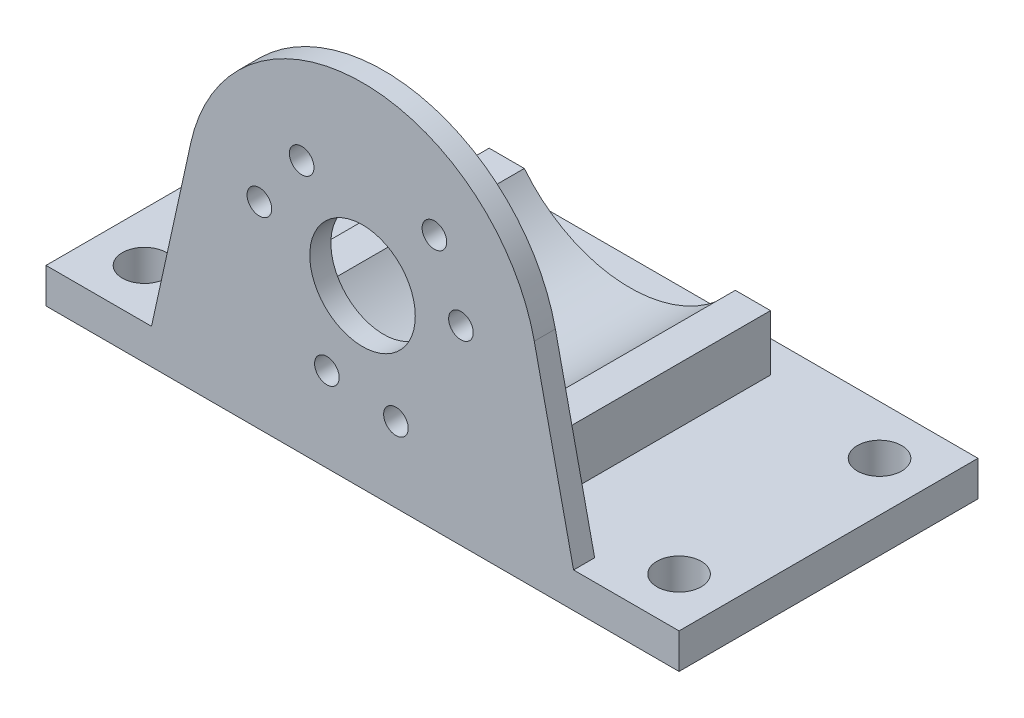
ISO-10303-21;
HEADER;
FILE_DESCRIPTION(('STEP AP214'),'2;1');
FILE_NAME('part.step','',(''),(''),'','','');
FILE_SCHEMA(('AUTOMOTIVE_DESIGN { 1 0 10303 214 1 1 1 1 }'));
ENDSEC;
DATA;
#1=APPLICATION_CONTEXT('core data for automotive mechanical design processes');
#2=APPLICATION_PROTOCOL_DEFINITION('international standard','automotive_design',2000,#1);
#3=PRODUCT_CONTEXT('',#1,'mechanical');
#4=PRODUCT('Part','Part','',(#3));
#5=PRODUCT_RELATED_PRODUCT_CATEGORY('part','',(#4));
#6=PRODUCT_DEFINITION_FORMATION('','',#4);
#7=PRODUCT_DEFINITION_CONTEXT('part definition',#1,'design');
#8=PRODUCT_DEFINITION('design','',#6,#7);
#9=PRODUCT_DEFINITION_SHAPE('','',#8);
#10=(LENGTH_UNIT() NAMED_UNIT(*) SI_UNIT(.MILLI.,.METRE.));
#11=(NAMED_UNIT(*) PLANE_ANGLE_UNIT() SI_UNIT($,.RADIAN.));
#12=(NAMED_UNIT(*) SI_UNIT($,.STERADIAN.) SOLID_ANGLE_UNIT());
#13=UNCERTAINTY_MEASURE_WITH_UNIT(LENGTH_MEASURE(1.E-05),#10,'distance_accuracy_value','');
#14=(GEOMETRIC_REPRESENTATION_CONTEXT(3) GLOBAL_UNCERTAINTY_ASSIGNED_CONTEXT((#13)) GLOBAL_UNIT_ASSIGNED_CONTEXT((#10,
#11,#12)) REPRESENTATION_CONTEXT('',''));
#15=CARTESIAN_POINT('',(0.,0.,0.));
#16=DIRECTION('',(0.,0.,1.));
#17=DIRECTION('',(1.,0.,0.));
#18=AXIS2_PLACEMENT_3D('',#15,#16,#17);
#19=CARTESIAN_POINT('',(0.,5.,0.));
#20=DIRECTION('',(0.,1.,0.));
#21=DIRECTION('',(0.,0.,1.));
#22=AXIS2_PLACEMENT_3D('',#19,#20,#21);
#23=PLANE('',#22);
#24=CARTESIAN_POINT('',(38.,5.,14.25));
#25=DIRECTION('',(0.,1.,0.));
#26=DIRECTION('',(0.,0.,1.));
#27=AXIS2_PLACEMENT_3D('',#24,#25,#26);
#28=CIRCLE('',#27,3.15);
#29=CARTESIAN_POINT('',(38.,5.,17.4));
#30=VERTEX_POINT('',#29);
#31=EDGE_CURVE('E322',#30,#30,#28,.T.);
#32=ORIENTED_EDGE('',*,*,#31,.F.);
#33=EDGE_LOOP('',(#32));
#34=FACE_BOUND('',#33,.T.);
#35=CARTESIAN_POINT('',(-38.,5.,-14.25));
#36=DIRECTION('',(0.,1.,0.));
#37=DIRECTION('',(0.,0.,1.));
#38=AXIS2_PLACEMENT_3D('',#35,#36,#37);
#39=CIRCLE('',#38,3.15);
#40=CARTESIAN_POINT('',(-38.,5.,-11.1));
#41=VERTEX_POINT('',#40);
#42=EDGE_CURVE('E338',#41,#41,#39,.T.);
#43=ORIENTED_EDGE('',*,*,#42,.F.);
#44=EDGE_LOOP('',(#43));
#45=FACE_BOUND('',#44,.T.);
#46=CARTESIAN_POINT('',(38.,5.,-14.25));
#47=DIRECTION('',(0.,1.,0.));
#48=DIRECTION('',(0.,0.,-1.));
#49=AXIS2_PLACEMENT_3D('',#46,#47,#48);
#50=CIRCLE('',#49,3.15);
#51=CARTESIAN_POINT('',(38.,5.,-17.4));
#52=VERTEX_POINT('',#51);
#53=EDGE_CURVE('E330',#52,#52,#50,.T.);
#54=ORIENTED_EDGE('',*,*,#53,.F.);
#55=EDGE_LOOP('',(#54));
#56=FACE_BOUND('',#55,.T.);
#57=CARTESIAN_POINT('',(-38.,5.,14.25));
#58=DIRECTION('',(0.,1.,0.));
#59=DIRECTION('',(0.,0.,-1.));
#60=AXIS2_PLACEMENT_3D('',#57,#58,#59);
#61=CIRCLE('',#60,3.15);
#62=CARTESIAN_POINT('',(-38.,5.,11.1));
#63=VERTEX_POINT('',#62);
#64=EDGE_CURVE('E314',#63,#63,#61,.T.);
#65=ORIENTED_EDGE('',*,*,#64,.F.);
#66=EDGE_LOOP('',(#65));
#67=FACE_BOUND('',#66,.T.);
#68=DIRECTION('',(-1.,0.,0.));
#69=VECTOR('',#68,1.);
#70=CARTESIAN_POINT('',(0.,5.,-16.75));
#71=LINE('',#70,#69);
#72=CARTESIAN_POINT('',(20.,5.,-16.75));
#73=VERTEX_POINT('',#72);
#74=CARTESIAN_POINT('',(-20.,5.,-16.75));
#75=VERTEX_POINT('',#74);
#76=EDGE_CURVE('E180',#73,#75,#71,.T.);
#77=ORIENTED_EDGE('',*,*,#76,.F.);
#78=DIRECTION('',(0.,0.,1.));
#79=VECTOR('',#78,1.);
#80=CARTESIAN_POINT('',(20.,5.,-16.75));
#81=LINE('',#80,#79);
#82=CARTESIAN_POINT('',(20.,5.,18.25));
#83=VERTEX_POINT('',#82);
#84=EDGE_CURVE('E213',#73,#83,#81,.T.);
#85=ORIENTED_EDGE('',*,*,#84,.T.);
#86=DIRECTION('',(-1.,0.,0.));
#87=VECTOR('',#86,1.);
#88=CARTESIAN_POINT('',(0.,5.,18.25));
#89=LINE('',#88,#87);
#90=CARTESIAN_POINT('',(30.,5.,18.25));
#91=VERTEX_POINT('',#90);
#92=EDGE_CURVE('E260',#91,#83,#89,.T.);
#93=ORIENTED_EDGE('',*,*,#92,.F.);
#94=DIRECTION('',(0.,0.,1.));
#95=VECTOR('',#94,1.);
#96=CARTESIAN_POINT('',(30.,5.,18.25));
#97=LINE('',#96,#95);
#98=CARTESIAN_POINT('',(30.,5.,21.25));
#99=VERTEX_POINT('',#98);
#100=EDGE_CURVE('E301',#91,#99,#97,.T.);
#101=ORIENTED_EDGE('',*,*,#100,.T.);
#102=DIRECTION('',(1.,0.,0.));
#103=VECTOR('',#102,1.);
#104=CARTESIAN_POINT('',(-45.,5.,21.25));
#105=LINE('',#104,#103);
#106=CARTESIAN_POINT('',(45.,5.,21.25));
#107=VERTEX_POINT('',#106);
#108=EDGE_CURVE('E357',#99,#107,#105,.T.);
#109=ORIENTED_EDGE('',*,*,#108,.T.);
#110=DIRECTION('',(0.,0.,-1.));
#111=VECTOR('',#110,1.);
#112=CARTESIAN_POINT('',(45.,5.,-21.25));
#113=LINE('',#112,#111);
#114=CARTESIAN_POINT('',(45.,5.,-21.25));
#115=VERTEX_POINT('',#114);
#116=EDGE_CURVE('E346',#107,#115,#113,.T.);
#117=ORIENTED_EDGE('',*,*,#116,.T.);
#118=DIRECTION('',(-1.,0.,0.));
#119=VECTOR('',#118,1.);
#120=CARTESIAN_POINT('',(-45.,5.,-21.25));
#121=LINE('',#120,#119);
#122=CARTESIAN_POINT('',(-45.,5.,-21.25));
#123=VERTEX_POINT('',#122);
#124=EDGE_CURVE('E350',#115,#123,#121,.T.);
#125=ORIENTED_EDGE('',*,*,#124,.T.);
#126=DIRECTION('',(0.,0.,1.));
#127=VECTOR('',#126,1.);
#128=CARTESIAN_POINT('',(-45.,5.,-21.25));
#129=LINE('',#128,#127);
#130=CARTESIAN_POINT('',(-45.,5.,21.25));
#131=VERTEX_POINT('',#130);
#132=EDGE_CURVE('E354',#123,#131,#129,.T.);
#133=ORIENTED_EDGE('',*,*,#132,.T.);
#134=CARTESIAN_POINT('',(-30.,5.,21.25));
#135=VERTEX_POINT('',#134);
#136=EDGE_CURVE('E358',#131,#135,#105,.T.);
#137=ORIENTED_EDGE('',*,*,#136,.T.);
#138=DIRECTION('',(0.,0.,1.));
#139=VECTOR('',#138,1.);
#140=CARTESIAN_POINT('',(-30.,5.,18.25));
#141=LINE('',#140,#139);
#142=CARTESIAN_POINT('',(-30.,5.,18.25));
#143=VERTEX_POINT('',#142);
#144=EDGE_CURVE('E305',#143,#135,#141,.T.);
#145=ORIENTED_EDGE('',*,*,#144,.F.);
#146=CARTESIAN_POINT('',(-20.,5.,18.25));
#147=VERTEX_POINT('',#146);
#148=EDGE_CURVE('E259',#147,#143,#89,.T.);
#149=ORIENTED_EDGE('',*,*,#148,.F.);
#150=DIRECTION('',(0.,0.,1.));
#151=VECTOR('',#150,1.);
#152=CARTESIAN_POINT('',(-20.,5.,-16.75));
#153=LINE('',#152,#151);
#154=EDGE_CURVE('E210',#75,#147,#153,.T.);
#155=ORIENTED_EDGE('',*,*,#154,.F.);
#156=EDGE_LOOP('',(#77,#85,#93,#101,#109,#117,#125,#133,#137,#145,#149,#155));
#157=FACE_BOUND('',#156,.T.);
#158=ADVANCED_FACE('F47',(#34,#45,#56,#67,#157),#23,.T.);
#159=CARTESIAN_POINT('',(0.,0.,18.25));
#160=DIRECTION('',(0.,0.,1.));
#161=DIRECTION('',(1.,0.,0.));
#162=AXIS2_PLACEMENT_3D('',#159,#160,#161);
#163=PLANE('',#162);
#164=CARTESIAN_POINT('',(13.9903829105898,27.0800764669677,18.25));
#165=DIRECTION('',(0.,0.,1.));
#166=DIRECTION('',(1.,0.,0.));
#167=AXIS2_PLACEMENT_3D('',#164,#165,#166);
#168=CIRCLE('',#167,1.75);
#169=CARTESIAN_POINT('',(15.7403829105898,27.0800764669677,18.25));
#170=VERTEX_POINT('',#169);
#171=EDGE_CURVE('E244',#170,#170,#168,.T.);
#172=ORIENTED_EDGE('',*,*,#171,.T.);
#173=EDGE_LOOP('',(#172));
#174=FACE_BOUND('',#173,.T.);
#175=CARTESIAN_POINT('',(10.2192370904754,36.3473419683963,18.25));
#176=DIRECTION('',(0.,0.,1.));
#177=DIRECTION('',(1.,0.,0.));
#178=AXIS2_PLACEMENT_3D('',#175,#176,#177);
#179=CIRCLE('',#178,1.75);
#180=CARTESIAN_POINT('',(11.9692370904754,36.3473419683963,18.25));
#181=VERTEX_POINT('',#180);
#182=EDGE_CURVE('E240',#181,#181,#179,.T.);
#183=ORIENTED_EDGE('',*,*,#182,.T.);
#184=EDGE_LOOP('',(#183));
#185=FACE_BOUND('',#184,.T.);
#186=CARTESIAN_POINT('',(-8.65491712777868,36.0874568844961,18.25));
#187=DIRECTION('',(0.,0.,1.));
#188=DIRECTION('',(1.,0.,0.));
#189=AXIS2_PLACEMENT_3D('',#186,#187,#188);
#190=CIRCLE('',#189,1.75);
#191=CARTESIAN_POINT('',(-6.90491712777868,36.0874568844961,18.25));
#192=VERTEX_POINT('',#191);
#193=EDGE_CURVE('E236',#192,#192,#190,.T.);
#194=ORIENTED_EDGE('',*,*,#193,.T.);
#195=EDGE_LOOP('',(#194));
#196=FACE_BOUND('',#195,.T.);
#197=CARTESIAN_POINT('',(-14.6673091016595,27.9922843829282,18.25));
#198=DIRECTION('',(0.,0.,1.));
#199=DIRECTION('',(1.,0.,0.));
#200=AXIS2_PLACEMENT_3D('',#197,#198,#199);
#201=CIRCLE('',#200,1.75);
#202=CARTESIAN_POINT('',(-12.9173091016595,27.9922843829282,18.25));
#203=VERTEX_POINT('',#202);
#204=EDGE_CURVE('E232',#203,#203,#201,.T.);
#205=ORIENTED_EDGE('',*,*,#204,.T.);
#206=EDGE_LOOP('',(#205));
#207=FACE_BOUND('',#206,.T.);
#208=CARTESIAN_POINT('',(-5.06730370484335,12.0109199939488,18.25));
#209=DIRECTION('',(0.,0.,1.));
#210=DIRECTION('',(1.,0.,0.));
#211=AXIS2_PLACEMENT_3D('',#208,#209,#210);
#212=CIRCLE('',#211,1.75);
#213=CARTESIAN_POINT('',(-3.31730370484335,12.0109199939488,18.25));
#214=VERTEX_POINT('',#213);
#215=EDGE_CURVE('E228',#214,#214,#212,.T.);
#216=ORIENTED_EDGE('',*,*,#215,.T.);
#217=EDGE_LOOP('',(#216));
#218=FACE_BOUND('',#217,.T.);
#219=CARTESIAN_POINT('',(4.74937698328635,10.6747141519983,18.25));
#220=DIRECTION('',(0.,0.,1.));
#221=DIRECTION('',(1.,0.,0.));
#222=AXIS2_PLACEMENT_3D('',#219,#220,#221);
#223=CIRCLE('',#222,1.75);
#224=CARTESIAN_POINT('',(6.49937698328635,10.6747141519983,18.25));
#225=VERTEX_POINT('',#224);
#226=EDGE_CURVE('E223',#225,#225,#223,.T.);
#227=ORIENTED_EDGE('',*,*,#226,.T.);
#228=EDGE_LOOP('',(#227));
#229=FACE_BOUND('',#228,.T.);
#230=CARTESIAN_POINT('',(0.,25.,18.25));
#231=DIRECTION('',(0.,0.,1.));
#232=DIRECTION('',(1.,0.,0.));
#233=AXIS2_PLACEMENT_3D('',#230,#231,#232);
#234=CIRCLE('',#233,7.5);
#235=CARTESIAN_POINT('',(7.5,25.,18.25));
#236=VERTEX_POINT('',#235);
#237=EDGE_CURVE('E219',#236,#236,#234,.T.);
#238=ORIENTED_EDGE('',*,*,#237,.T.);
#239=EDGE_LOOP('',(#238));
#240=FACE_BOUND('',#239,.T.);
#241=DIRECTION('',(0.,-1.,0.));
#242=VECTOR('',#241,1.);
#243=CARTESIAN_POINT('',(20.,0.,18.25));
#244=LINE('',#243,#242);
#245=CARTESIAN_POINT('',(20.,12.9350714879863,18.25));
#246=VERTEX_POINT('',#245);
#247=EDGE_CURVE('E197',#246,#83,#244,.T.);
#248=ORIENTED_EDGE('',*,*,#247,.F.);
#249=DIRECTION('',(-1.,0.,0.));
#250=VECTOR('',#249,1.);
#251=CARTESIAN_POINT('',(0.,12.9350714879863,18.25));
#252=LINE('',#251,#250);
#253=CARTESIAN_POINT('',(15.,12.9350714879863,18.25));
#254=VERTEX_POINT('',#253);
#255=EDGE_CURVE('E194',#246,#254,#252,.T.);
#256=ORIENTED_EDGE('',*,*,#255,.T.);
#257=CARTESIAN_POINT('',(0.,25.,18.25));
#258=DIRECTION('',(0.,0.,-1.));
#259=DIRECTION('',(-1.,0.,0.));
#260=AXIS2_PLACEMENT_3D('',#257,#258,#259);
#261=CIRCLE('',#260,19.25);
#262=CARTESIAN_POINT('',(-15.,12.9350714879863,18.25));
#263=VERTEX_POINT('',#262);
#264=EDGE_CURVE('E155',#254,#263,#261,.T.);
#265=ORIENTED_EDGE('',*,*,#264,.T.);
#266=DIRECTION('',(-1.,0.,0.));
#267=VECTOR('',#266,1.);
#268=CARTESIAN_POINT('',(0.,12.9350714879863,18.25));
#269=LINE('',#268,#267);
#270=CARTESIAN_POINT('',(-20.,12.9350714879863,18.25));
#271=VERTEX_POINT('',#270);
#272=EDGE_CURVE('E172',#263,#271,#269,.T.);
#273=ORIENTED_EDGE('',*,*,#272,.T.);
#274=DIRECTION('',(0.,-1.,0.));
#275=VECTOR('',#274,1.);
#276=CARTESIAN_POINT('',(-20.,0.,18.25));
#277=LINE('',#276,#275);
#278=EDGE_CURVE('E63',#271,#147,#277,.T.);
#279=ORIENTED_EDGE('',*,*,#278,.T.);
#280=ORIENTED_EDGE('',*,*,#148,.T.);
#281=DIRECTION('',(0.214940664158457,0.976627109438972,0.));
#282=VECTOR('',#281,1.);
#283=CARTESIAN_POINT('',(-29.6635997244235,6.5285038316834,18.25));
#284=LINE('',#283,#282);
#285=CARTESIAN_POINT('',(-24.4156777359743,30.3735166039614,18.25));
#286=VERTEX_POINT('',#285);
#287=EDGE_CURVE('E256',#143,#286,#284,.T.);
#288=ORIENTED_EDGE('',*,*,#287,.T.);
#289=CARTESIAN_POINT('',(0.,25.,18.25));
#290=DIRECTION('',(0.,0.,1.));
#291=DIRECTION('',(1.,0.,0.));
#292=AXIS2_PLACEMENT_3D('',#289,#290,#291);
#293=CIRCLE('',#292,25.);
#294=CARTESIAN_POINT('',(24.4156777359743,30.3735166039614,18.25));
#295=VERTEX_POINT('',#294);
#296=EDGE_CURVE('E252',#295,#286,#293,.T.);
#297=ORIENTED_EDGE('',*,*,#296,.F.);
#298=DIRECTION('',(-0.214940664158457,0.976627109438972,0.));
#299=VECTOR('',#298,1.);
#300=CARTESIAN_POINT('',(29.6635997244235,6.5285038316834,18.25));
#301=LINE('',#300,#299);
#302=EDGE_CURVE('E248',#91,#295,#301,.T.);
#303=ORIENTED_EDGE('',*,*,#302,.F.);
#304=ORIENTED_EDGE('',*,*,#92,.T.);
#305=EDGE_LOOP('',(#248,#256,#265,#273,#279,#280,#288,#297,#303,#304));
#306=FACE_BOUND('',#305,.T.);
#307=ADVANCED_FACE('F412',(#174,#185,#196,#207,#218,#229,#240,#306),#163,.F.);
#308=CARTESIAN_POINT('',(0.,0.,0.));
#309=DIRECTION('',(0.,1.,0.));
#310=DIRECTION('',(0.,0.,1.));
#311=AXIS2_PLACEMENT_3D('',#308,#309,#310);
#312=PLANE('',#311);
#313=DIRECTION('',(0.,0.,-1.));
#314=VECTOR('',#313,1.);
#315=CARTESIAN_POINT('',(45.,0.,-21.25));
#316=LINE('',#315,#314);
#317=CARTESIAN_POINT('',(45.,0.,21.25));
#318=VERTEX_POINT('',#317);
#319=CARTESIAN_POINT('',(45.,0.,-21.25));
#320=VERTEX_POINT('',#319);
#321=EDGE_CURVE('E342',#318,#320,#316,.T.);
#322=ORIENTED_EDGE('',*,*,#321,.F.);
#323=DIRECTION('',(1.,0.,0.));
#324=VECTOR('',#323,1.);
#325=CARTESIAN_POINT('',(-45.,0.,21.25));
#326=LINE('',#325,#324);
#327=CARTESIAN_POINT('',(-45.,0.,21.25));
#328=VERTEX_POINT('',#327);
#329=EDGE_CURVE('E351',#328,#318,#326,.T.);
#330=ORIENTED_EDGE('',*,*,#329,.F.);
#331=DIRECTION('',(0.,0.,1.));
#332=VECTOR('',#331,1.);
#333=CARTESIAN_POINT('',(-45.,0.,-21.25));
#334=LINE('',#333,#332);
#335=CARTESIAN_POINT('',(-45.,0.,-21.25));
#336=VERTEX_POINT('',#335);
#337=EDGE_CURVE('E369',#336,#328,#334,.T.);
#338=ORIENTED_EDGE('',*,*,#337,.F.);
#339=DIRECTION('',(-1.,0.,0.));
#340=VECTOR('',#339,1.);
#341=CARTESIAN_POINT('',(-45.,0.,-21.25));
#342=LINE('',#341,#340);
#343=EDGE_CURVE('E366',#320,#336,#342,.T.);
#344=ORIENTED_EDGE('',*,*,#343,.F.);
#345=EDGE_LOOP('',(#322,#330,#338,#344));
#346=FACE_BOUND('',#345,.T.);
#347=CARTESIAN_POINT('',(-38.,0.,-14.25));
#348=DIRECTION('',(0.,1.,0.));
#349=DIRECTION('',(0.,0.,1.));
#350=AXIS2_PLACEMENT_3D('',#347,#348,#349);
#351=CIRCLE('',#350,3.15);
#352=CARTESIAN_POINT('',(-38.,0.,-11.1));
#353=VERTEX_POINT('',#352);
#354=EDGE_CURVE('E334',#353,#353,#351,.T.);
#355=ORIENTED_EDGE('',*,*,#354,.T.);
#356=EDGE_LOOP('',(#355));
#357=FACE_BOUND('',#356,.T.);
#358=CARTESIAN_POINT('',(38.,0.,-14.25));
#359=DIRECTION('',(0.,1.,0.));
#360=DIRECTION('',(0.,0.,-1.));
#361=AXIS2_PLACEMENT_3D('',#358,#359,#360);
#362=CIRCLE('',#361,3.15);
#363=CARTESIAN_POINT('',(38.,0.,-17.4));
#364=VERTEX_POINT('',#363);
#365=EDGE_CURVE('E326',#364,#364,#362,.T.);
#366=ORIENTED_EDGE('',*,*,#365,.T.);
#367=EDGE_LOOP('',(#366));
#368=FACE_BOUND('',#367,.T.);
#369=CARTESIAN_POINT('',(38.,0.,14.25));
#370=DIRECTION('',(0.,1.,0.));
#371=DIRECTION('',(0.,0.,1.));
#372=AXIS2_PLACEMENT_3D('',#369,#370,#371);
#373=CIRCLE('',#372,3.15);
#374=CARTESIAN_POINT('',(38.,0.,17.4));
#375=VERTEX_POINT('',#374);
#376=EDGE_CURVE('E318',#375,#375,#373,.T.);
#377=ORIENTED_EDGE('',*,*,#376,.T.);
#378=EDGE_LOOP('',(#377));
#379=FACE_BOUND('',#378,.T.);
#380=CARTESIAN_POINT('',(-38.,0.,14.25));
#381=DIRECTION('',(0.,1.,0.));
#382=DIRECTION('',(0.,0.,-1.));
#383=AXIS2_PLACEMENT_3D('',#380,#381,#382);
#384=CIRCLE('',#383,3.15);
#385=CARTESIAN_POINT('',(-38.,0.,11.1));
#386=VERTEX_POINT('',#385);
#387=EDGE_CURVE('E304',#386,#386,#384,.T.);
#388=ORIENTED_EDGE('',*,*,#387,.T.);
#389=EDGE_LOOP('',(#388));
#390=FACE_BOUND('',#389,.T.);
#391=ADVANCED_FACE('F392',(#346,#357,#368,#379,#390),#312,.F.);
#392=CARTESIAN_POINT('',(45.,5.,-21.25));
#393=DIRECTION('',(-1.,0.,0.));
#394=DIRECTION('',(0.,0.,1.));
#395=AXIS2_PLACEMENT_3D('',#392,#393,#394);
#396=PLANE('',#395);
#397=ORIENTED_EDGE('',*,*,#321,.T.);
#398=DIRECTION('',(0.,-1.,0.));
#399=VECTOR('',#398,1.);
#400=CARTESIAN_POINT('',(45.,5.,-21.25));
#401=LINE('',#400,#399);
#402=EDGE_CURVE('E11',#115,#320,#401,.T.);
#403=ORIENTED_EDGE('',*,*,#402,.F.);
#404=ORIENTED_EDGE('',*,*,#116,.F.);
#405=DIRECTION('',(0.,-1.,0.));
#406=VECTOR('',#405,1.);
#407=CARTESIAN_POINT('',(45.,5.,21.25));
#408=LINE('',#407,#406);
#409=EDGE_CURVE('E362',#107,#318,#408,.T.);
#410=ORIENTED_EDGE('',*,*,#409,.T.);
#411=EDGE_LOOP('',(#397,#403,#404,#410));
#412=FACE_BOUND('',#411,.T.);
#413=ADVANCED_FACE('F49',(#412),#396,.F.);
#414=CARTESIAN_POINT('',(-45.,5.,-21.25));
#415=DIRECTION('',(0.,0.,1.));
#416=DIRECTION('',(1.,0.,0.));
#417=AXIS2_PLACEMENT_3D('',#414,#415,#416);
#418=PLANE('',#417);
#419=ORIENTED_EDGE('',*,*,#343,.T.);
#420=DIRECTION('',(0.,-1.,0.));
#421=VECTOR('',#420,1.);
#422=CARTESIAN_POINT('',(-45.,5.,-21.25));
#423=LINE('',#422,#421);
#424=EDGE_CURVE('E56',#123,#336,#423,.T.);
#425=ORIENTED_EDGE('',*,*,#424,.F.);
#426=ORIENTED_EDGE('',*,*,#124,.F.);
#427=ORIENTED_EDGE('',*,*,#402,.T.);
#428=EDGE_LOOP('',(#419,#425,#426,#427));
#429=FACE_BOUND('',#428,.T.);
#430=ADVANCED_FACE('F458',(#429),#418,.F.);
#431=CARTESIAN_POINT('',(-45.,5.,-21.25));
#432=DIRECTION('',(1.,0.,0.));
#433=DIRECTION('',(0.,0.,-1.));
#434=AXIS2_PLACEMENT_3D('',#431,#432,#433);
#435=PLANE('',#434);
#436=ORIENTED_EDGE('',*,*,#337,.T.);
#437=DIRECTION('',(0.,-1.,0.));
#438=VECTOR('',#437,1.);
#439=CARTESIAN_POINT('',(-45.,5.,21.25));
#440=LINE('',#439,#438);
#441=EDGE_CURVE('E377',#131,#328,#440,.T.);
#442=ORIENTED_EDGE('',*,*,#441,.F.);
#443=ORIENTED_EDGE('',*,*,#132,.F.);
#444=ORIENTED_EDGE('',*,*,#424,.T.);
#445=EDGE_LOOP('',(#436,#442,#443,#444));
#446=FACE_BOUND('',#445,.T.);
#447=ADVANCED_FACE('F386',(#446),#435,.F.);
#448=CARTESIAN_POINT('',(-45.,5.,21.25));
#449=DIRECTION('',(0.,0.,-1.));
#450=DIRECTION('',(-1.,0.,0.));
#451=AXIS2_PLACEMENT_3D('',#448,#449,#450);
#452=PLANE('',#451);
#453=ORIENTED_EDGE('',*,*,#329,.T.);
#454=ORIENTED_EDGE('',*,*,#409,.F.);
#455=ORIENTED_EDGE('',*,*,#108,.F.);
#456=DIRECTION('',(-0.214940664158457,0.976627109438972,0.));
#457=VECTOR('',#456,1.);
#458=CARTESIAN_POINT('',(29.6635997244235,6.5285038316834,21.25));
#459=LINE('',#458,#457);
#460=CARTESIAN_POINT('',(24.4156777359743,30.3735166039614,21.25));
#461=VERTEX_POINT('',#460);
#462=EDGE_CURVE('E71',#99,#461,#459,.T.);
#463=ORIENTED_EDGE('',*,*,#462,.T.);
#464=CARTESIAN_POINT('',(0.,25.,21.25));
#465=DIRECTION('',(0.,0.,1.));
#466=DIRECTION('',(1.,0.,0.));
#467=AXIS2_PLACEMENT_3D('',#464,#465,#466);
#468=CIRCLE('',#467,25.);
#469=CARTESIAN_POINT('',(-24.4156777359743,30.3735166039614,21.25));
#470=VERTEX_POINT('',#469);
#471=EDGE_CURVE('E294',#461,#470,#468,.T.);
#472=ORIENTED_EDGE('',*,*,#471,.T.);
#473=DIRECTION('',(0.214940664158457,0.976627109438972,0.));
#474=VECTOR('',#473,1.);
#475=CARTESIAN_POINT('',(-29.6635997244235,6.5285038316834,21.25));
#476=LINE('',#475,#474);
#477=EDGE_CURVE('E224',#135,#470,#476,.T.);
#478=ORIENTED_EDGE('',*,*,#477,.F.);
#479=ORIENTED_EDGE('',*,*,#136,.F.);
#480=ORIENTED_EDGE('',*,*,#441,.T.);
#481=EDGE_LOOP('',(#453,#454,#455,#463,#472,#478,#479,#480));
#482=FACE_BOUND('',#481,.T.);
#483=CARTESIAN_POINT('',(0.,25.,21.25));
#484=DIRECTION('',(0.,0.,1.));
#485=DIRECTION('',(1.,0.,0.));
#486=AXIS2_PLACEMENT_3D('',#483,#484,#485);
#487=CIRCLE('',#486,7.5);
#488=CARTESIAN_POINT('',(7.5,25.,21.25));
#489=VERTEX_POINT('',#488);
#490=EDGE_CURVE('E161',#489,#489,#487,.T.);
#491=ORIENTED_EDGE('',*,*,#490,.F.);
#492=EDGE_LOOP('',(#491));
#493=FACE_BOUND('',#492,.T.);
#494=CARTESIAN_POINT('',(4.74937698328635,10.6747141519983,21.25));
#495=DIRECTION('',(0.,0.,1.));
#496=DIRECTION('',(1.,0.,0.));
#497=AXIS2_PLACEMENT_3D('',#494,#495,#496);
#498=CIRCLE('',#497,1.75);
#499=CARTESIAN_POINT('',(6.49937698328635,10.6747141519983,21.25));
#500=VERTEX_POINT('',#499);
#501=EDGE_CURVE('E268',#500,#500,#498,.T.);
#502=ORIENTED_EDGE('',*,*,#501,.F.);
#503=EDGE_LOOP('',(#502));
#504=FACE_BOUND('',#503,.T.);
#505=CARTESIAN_POINT('',(-5.06730370484335,12.0109199939488,21.25));
#506=DIRECTION('',(0.,0.,1.));
#507=DIRECTION('',(1.,0.,0.));
#508=AXIS2_PLACEMENT_3D('',#505,#506,#507);
#509=CIRCLE('',#508,1.75);
#510=CARTESIAN_POINT('',(-3.31730370484335,12.0109199939488,21.25));
#511=VERTEX_POINT('',#510);
#512=EDGE_CURVE('E272',#511,#511,#509,.T.);
#513=ORIENTED_EDGE('',*,*,#512,.F.);
#514=EDGE_LOOP('',(#513));
#515=FACE_BOUND('',#514,.T.);
#516=CARTESIAN_POINT('',(-14.6673091016595,27.9922843829282,21.25));
#517=DIRECTION('',(0.,0.,1.));
#518=DIRECTION('',(1.,0.,0.));
#519=AXIS2_PLACEMENT_3D('',#516,#517,#518);
#520=CIRCLE('',#519,1.75);
#521=CARTESIAN_POINT('',(-12.9173091016595,27.9922843829282,21.25));
#522=VERTEX_POINT('',#521);
#523=EDGE_CURVE('E276',#522,#522,#520,.T.);
#524=ORIENTED_EDGE('',*,*,#523,.F.);
#525=EDGE_LOOP('',(#524));
#526=FACE_BOUND('',#525,.T.);
#527=CARTESIAN_POINT('',(-8.65491712777868,36.0874568844961,21.25));
#528=DIRECTION('',(0.,0.,1.));
#529=DIRECTION('',(1.,0.,0.));
#530=AXIS2_PLACEMENT_3D('',#527,#528,#529);
#531=CIRCLE('',#530,1.75);
#532=CARTESIAN_POINT('',(-6.90491712777868,36.0874568844961,21.25));
#533=VERTEX_POINT('',#532);
#534=EDGE_CURVE('E280',#533,#533,#531,.T.);
#535=ORIENTED_EDGE('',*,*,#534,.F.);
#536=EDGE_LOOP('',(#535));
#537=FACE_BOUND('',#536,.T.);
#538=CARTESIAN_POINT('',(10.2192370904754,36.3473419683963,21.25));
#539=DIRECTION('',(0.,0.,1.));
#540=DIRECTION('',(1.,0.,0.));
#541=AXIS2_PLACEMENT_3D('',#538,#539,#540);
#542=CIRCLE('',#541,1.75);
#543=CARTESIAN_POINT('',(11.9692370904754,36.3473419683963,21.25));
#544=VERTEX_POINT('',#543);
#545=EDGE_CURVE('E284',#544,#544,#542,.T.);
#546=ORIENTED_EDGE('',*,*,#545,.F.);
#547=EDGE_LOOP('',(#546));
#548=FACE_BOUND('',#547,.T.);
#549=CARTESIAN_POINT('',(13.9903829105898,27.0800764669677,21.25));
#550=DIRECTION('',(0.,0.,1.));
#551=DIRECTION('',(1.,0.,0.));
#552=AXIS2_PLACEMENT_3D('',#549,#550,#551);
#553=CIRCLE('',#552,1.75);
#554=CARTESIAN_POINT('',(15.7403829105898,27.0800764669677,21.25));
#555=VERTEX_POINT('',#554);
#556=EDGE_CURVE('E288',#555,#555,#553,.T.);
#557=ORIENTED_EDGE('',*,*,#556,.F.);
#558=EDGE_LOOP('',(#557));
#559=FACE_BOUND('',#558,.T.);
#560=ADVANCED_FACE('F396',(#482,#493,#504,#515,#526,#537,#548,#559),#452,.F.);
#561=CARTESIAN_POINT('',(-38.,5.,-14.25));
#562=DIRECTION('',(0.,-1.,0.));
#563=DIRECTION('',(0.,0.,-1.));
#564=AXIS2_PLACEMENT_3D('',#561,#562,#563);
#565=CYLINDRICAL_SURFACE('',#564,3.15);
#566=ORIENTED_EDGE('',*,*,#42,.T.);
#567=EDGE_LOOP('',(#566));
#568=FACE_BOUND('',#567,.T.);
#569=ORIENTED_EDGE('',*,*,#354,.F.);
#570=EDGE_LOOP('',(#569));
#571=FACE_BOUND('',#570,.T.);
#572=ADVANCED_FACE('F452',(#568,#571),#565,.F.);
#573=CARTESIAN_POINT('',(38.,5.,-14.25));
#574=DIRECTION('',(0.,-1.,0.));
#575=DIRECTION('',(0.,0.,-1.));
#576=AXIS2_PLACEMENT_3D('',#573,#574,#575);
#577=CYLINDRICAL_SURFACE('',#576,3.15);
#578=ORIENTED_EDGE('',*,*,#53,.T.);
#579=EDGE_LOOP('',(#578));
#580=FACE_BOUND('',#579,.T.);
#581=ORIENTED_EDGE('',*,*,#365,.F.);
#582=EDGE_LOOP('',(#581));
#583=FACE_BOUND('',#582,.T.);
#584=ADVANCED_FACE('F495',(#580,#583),#577,.F.);
#585=CARTESIAN_POINT('',(38.,5.,14.25));
#586=DIRECTION('',(0.,-1.,0.));
#587=DIRECTION('',(0.,0.,-1.));
#588=AXIS2_PLACEMENT_3D('',#585,#586,#587);
#589=CYLINDRICAL_SURFACE('',#588,3.15);
#590=ORIENTED_EDGE('',*,*,#31,.T.);
#591=EDGE_LOOP('',(#590));
#592=FACE_BOUND('',#591,.T.);
#593=ORIENTED_EDGE('',*,*,#376,.F.);
#594=EDGE_LOOP('',(#593));
#595=FACE_BOUND('',#594,.T.);
#596=ADVANCED_FACE('F434',(#592,#595),#589,.F.);
#597=CARTESIAN_POINT('',(-38.,5.,14.25));
#598=DIRECTION('',(0.,-1.,0.));
#599=DIRECTION('',(0.,0.,-1.));
#600=AXIS2_PLACEMENT_3D('',#597,#598,#599);
#601=CYLINDRICAL_SURFACE('',#600,3.15);
#602=ORIENTED_EDGE('',*,*,#64,.T.);
#603=EDGE_LOOP('',(#602));
#604=FACE_BOUND('',#603,.T.);
#605=ORIENTED_EDGE('',*,*,#387,.F.);
#606=EDGE_LOOP('',(#605));
#607=FACE_BOUND('',#606,.T.);
#608=ADVANCED_FACE('F425',(#604,#607),#601,.F.);
#609=CARTESIAN_POINT('',(29.6635997244235,6.5285038316834,18.25));
#610=DIRECTION('',(0.976627109438972,0.214940664158457,0.));
#611=DIRECTION('',(-0.214940664158457,0.976627109438972,0.));
#612=AXIS2_PLACEMENT_3D('',#609,#610,#611);
#613=PLANE('',#612);
#614=ORIENTED_EDGE('',*,*,#462,.F.);
#615=ORIENTED_EDGE('',*,*,#100,.F.);
#616=ORIENTED_EDGE('',*,*,#302,.T.);
#617=DIRECTION('',(0.,0.,1.));
#618=VECTOR('',#617,1.);
#619=CARTESIAN_POINT('',(24.4156777359743,30.3735166039614,18.25));
#620=LINE('',#619,#618);
#621=EDGE_CURVE('E264',#295,#461,#620,.T.);
#622=ORIENTED_EDGE('',*,*,#621,.T.);
#623=EDGE_LOOP('',(#614,#615,#616,#622));
#624=FACE_BOUND('',#623,.T.);
#625=ADVANCED_FACE('F423',(#624),#613,.T.);
#626=CARTESIAN_POINT('',(-29.6635997244235,6.5285038316834,18.25));
#627=DIRECTION('',(0.976627109438972,-0.214940664158457,0.));
#628=DIRECTION('',(0.214940664158457,0.976627109438972,0.));
#629=AXIS2_PLACEMENT_3D('',#626,#627,#628);
#630=PLANE('',#629);
#631=ORIENTED_EDGE('',*,*,#477,.T.);
#632=DIRECTION('',(0.,0.,1.));
#633=VECTOR('',#632,1.);
#634=CARTESIAN_POINT('',(-24.4156777359743,30.3735166039614,18.25));
#635=LINE('',#634,#633);
#636=EDGE_CURVE('E309',#286,#470,#635,.T.);
#637=ORIENTED_EDGE('',*,*,#636,.F.);
#638=ORIENTED_EDGE('',*,*,#287,.F.);
#639=ORIENTED_EDGE('',*,*,#144,.T.);
#640=EDGE_LOOP('',(#631,#637,#638,#639));
#641=FACE_BOUND('',#640,.T.);
#642=ADVANCED_FACE('F418',(#641),#630,.F.);
#643=CARTESIAN_POINT('',(13.9903829105898,27.0800764669677,18.25));
#644=DIRECTION('',(0.,0.,1.));
#645=DIRECTION('',(1.,0.,0.));
#646=AXIS2_PLACEMENT_3D('',#643,#644,#645);
#647=CYLINDRICAL_SURFACE('',#646,1.75);
#648=ORIENTED_EDGE('',*,*,#171,.F.);
#649=EDGE_LOOP('',(#648));
#650=FACE_BOUND('',#649,.T.);
#651=ORIENTED_EDGE('',*,*,#556,.T.);
#652=EDGE_LOOP('',(#651));
#653=FACE_BOUND('',#652,.T.);
#654=ADVANCED_FACE('F431',(#650,#653),#647,.F.);
#655=CARTESIAN_POINT('',(10.2192370904754,36.3473419683963,18.25));
#656=DIRECTION('',(0.,0.,1.));
#657=DIRECTION('',(1.,0.,0.));
#658=AXIS2_PLACEMENT_3D('',#655,#656,#657);
#659=CYLINDRICAL_SURFACE('',#658,1.75);
#660=ORIENTED_EDGE('',*,*,#182,.F.);
#661=EDGE_LOOP('',(#660));
#662=FACE_BOUND('',#661,.T.);
#663=ORIENTED_EDGE('',*,*,#545,.T.);
#664=EDGE_LOOP('',(#663));
#665=FACE_BOUND('',#664,.T.);
#666=ADVANCED_FACE('F533',(#662,#665),#659,.F.);
#667=CARTESIAN_POINT('',(-8.65491712777868,36.0874568844961,18.25));
#668=DIRECTION('',(0.,0.,1.));
#669=DIRECTION('',(1.,0.,0.));
#670=AXIS2_PLACEMENT_3D('',#667,#668,#669);
#671=CYLINDRICAL_SURFACE('',#670,1.75);
#672=ORIENTED_EDGE('',*,*,#193,.F.);
#673=EDGE_LOOP('',(#672));
#674=FACE_BOUND('',#673,.T.);
#675=ORIENTED_EDGE('',*,*,#534,.T.);
#676=EDGE_LOOP('',(#675));
#677=FACE_BOUND('',#676,.T.);
#678=ADVANCED_FACE('F541',(#674,#677),#671,.F.);
#679=CARTESIAN_POINT('',(-14.6673091016595,27.9922843829282,18.25));
#680=DIRECTION('',(0.,0.,1.));
#681=DIRECTION('',(1.,0.,0.));
#682=AXIS2_PLACEMENT_3D('',#679,#680,#681);
#683=CYLINDRICAL_SURFACE('',#682,1.75);
#684=ORIENTED_EDGE('',*,*,#204,.F.);
#685=EDGE_LOOP('',(#684));
#686=FACE_BOUND('',#685,.T.);
#687=ORIENTED_EDGE('',*,*,#523,.T.);
#688=EDGE_LOOP('',(#687));
#689=FACE_BOUND('',#688,.T.);
#690=ADVANCED_FACE('F550',(#686,#689),#683,.F.);
#691=CARTESIAN_POINT('',(-5.06730370484335,12.0109199939488,18.25));
#692=DIRECTION('',(0.,0.,1.));
#693=DIRECTION('',(1.,0.,0.));
#694=AXIS2_PLACEMENT_3D('',#691,#692,#693);
#695=CYLINDRICAL_SURFACE('',#694,1.75);
#696=ORIENTED_EDGE('',*,*,#215,.F.);
#697=EDGE_LOOP('',(#696));
#698=FACE_BOUND('',#697,.T.);
#699=ORIENTED_EDGE('',*,*,#512,.T.);
#700=EDGE_LOOP('',(#699));
#701=FACE_BOUND('',#700,.T.);
#702=ADVANCED_FACE('F559',(#698,#701),#695,.F.);
#703=CARTESIAN_POINT('',(4.74937698328635,10.6747141519983,18.25));
#704=DIRECTION('',(0.,0.,1.));
#705=DIRECTION('',(1.,0.,0.));
#706=AXIS2_PLACEMENT_3D('',#703,#704,#705);
#707=CYLINDRICAL_SURFACE('',#706,1.75);
#708=ORIENTED_EDGE('',*,*,#226,.F.);
#709=EDGE_LOOP('',(#708));
#710=FACE_BOUND('',#709,.T.);
#711=ORIENTED_EDGE('',*,*,#501,.T.);
#712=EDGE_LOOP('',(#711));
#713=FACE_BOUND('',#712,.T.);
#714=ADVANCED_FACE('F568',(#710,#713),#707,.F.);
#715=CARTESIAN_POINT('',(0.,25.,18.25));
#716=DIRECTION('',(0.,0.,1.));
#717=DIRECTION('',(1.,0.,0.));
#718=AXIS2_PLACEMENT_3D('',#715,#716,#717);
#719=CYLINDRICAL_SURFACE('',#718,7.5);
#720=ORIENTED_EDGE('',*,*,#237,.F.);
#721=EDGE_LOOP('',(#720));
#722=FACE_BOUND('',#721,.T.);
#723=ORIENTED_EDGE('',*,*,#490,.T.);
#724=EDGE_LOOP('',(#723));
#725=FACE_BOUND('',#724,.T.);
#726=ADVANCED_FACE('F577',(#722,#725),#719,.F.);
#727=CARTESIAN_POINT('',(0.,25.,18.25));
#728=DIRECTION('',(0.,0.,1.));
#729=DIRECTION('',(1.,0.,0.));
#730=AXIS2_PLACEMENT_3D('',#727,#728,#729);
#731=CYLINDRICAL_SURFACE('',#730,25.);
#732=ORIENTED_EDGE('',*,*,#471,.F.);
#733=ORIENTED_EDGE('',*,*,#621,.F.);
#734=ORIENTED_EDGE('',*,*,#296,.T.);
#735=ORIENTED_EDGE('',*,*,#636,.T.);
#736=EDGE_LOOP('',(#732,#733,#734,#735));
#737=FACE_BOUND('',#736,.T.);
#738=ADVANCED_FACE('F421',(#737),#731,.T.);
#739=CARTESIAN_POINT('',(0.,25.,-16.75));
#740=DIRECTION('',(0.,0.,1.));
#741=DIRECTION('',(1.,0.,0.));
#742=AXIS2_PLACEMENT_3D('',#739,#740,#741);
#743=CYLINDRICAL_SURFACE('',#742,19.25);
#744=ORIENTED_EDGE('',*,*,#264,.F.);
#745=DIRECTION('',(0.,0.,1.));
#746=VECTOR('',#745,1.);
#747=CARTESIAN_POINT('',(15.,12.9350714879863,-16.75));
#748=LINE('',#747,#746);
#749=CARTESIAN_POINT('',(15.,12.9350714879863,-16.75));
#750=VERTEX_POINT('',#749);
#751=EDGE_CURVE('E149',#750,#254,#748,.T.);
#752=ORIENTED_EDGE('',*,*,#751,.F.);
#753=CARTESIAN_POINT('',(0.,25.,-16.75));
#754=DIRECTION('',(0.,0.,-1.));
#755=DIRECTION('',(-1.,0.,0.));
#756=AXIS2_PLACEMENT_3D('',#753,#754,#755);
#757=CIRCLE('',#756,19.25);
#758=CARTESIAN_POINT('',(-15.,12.9350714879863,-16.75));
#759=VERTEX_POINT('',#758);
#760=EDGE_CURVE('E152',#750,#759,#757,.T.);
#761=ORIENTED_EDGE('',*,*,#760,.T.);
#762=DIRECTION('',(0.,0.,1.));
#763=VECTOR('',#762,1.);
#764=CARTESIAN_POINT('',(-15.,12.9350714879863,-16.75));
#765=LINE('',#764,#763);
#766=EDGE_CURVE('E191',#759,#263,#765,.T.);
#767=ORIENTED_EDGE('',*,*,#766,.T.);
#768=EDGE_LOOP('',(#744,#752,#761,#767));
#769=FACE_BOUND('',#768,.T.);
#770=ADVANCED_FACE('F151',(#769),#743,.F.);
#771=CARTESIAN_POINT('',(0.,12.9350714879863,-16.75));
#772=DIRECTION('',(0.,1.,0.));
#773=DIRECTION('',(0.,0.,1.));
#774=AXIS2_PLACEMENT_3D('',#771,#772,#773);
#775=PLANE('',#774);
#776=ORIENTED_EDGE('',*,*,#255,.F.);
#777=DIRECTION('',(0.,0.,1.));
#778=VECTOR('',#777,1.);
#779=CARTESIAN_POINT('',(20.,12.9350714879863,-16.75));
#780=LINE('',#779,#778);
#781=CARTESIAN_POINT('',(20.,12.9350714879863,-16.75));
#782=VERTEX_POINT('',#781);
#783=EDGE_CURVE('E162',#782,#246,#780,.T.);
#784=ORIENTED_EDGE('',*,*,#783,.F.);
#785=DIRECTION('',(-1.,0.,0.));
#786=VECTOR('',#785,1.);
#787=CARTESIAN_POINT('',(0.,12.9350714879863,-16.75));
#788=LINE('',#787,#786);
#789=EDGE_CURVE('E167',#782,#750,#788,.T.);
#790=ORIENTED_EDGE('',*,*,#789,.T.);
#791=ORIENTED_EDGE('',*,*,#751,.T.);
#792=EDGE_LOOP('',(#776,#784,#790,#791));
#793=FACE_BOUND('',#792,.T.);
#794=ADVANCED_FACE('F174',(#793),#775,.T.);
#795=CARTESIAN_POINT('',(20.,0.,-16.75));
#796=DIRECTION('',(-1.,0.,0.));
#797=DIRECTION('',(0.,-1.,0.));
#798=AXIS2_PLACEMENT_3D('',#795,#796,#797);
#799=PLANE('',#798);
#800=ORIENTED_EDGE('',*,*,#247,.T.);
#801=ORIENTED_EDGE('',*,*,#84,.F.);
#802=DIRECTION('',(0.,-1.,0.));
#803=VECTOR('',#802,1.);
#804=CARTESIAN_POINT('',(20.,0.,-16.75));
#805=LINE('',#804,#803);
#806=EDGE_CURVE('E177',#782,#73,#805,.T.);
#807=ORIENTED_EDGE('',*,*,#806,.F.);
#808=ORIENTED_EDGE('',*,*,#783,.T.);
#809=EDGE_LOOP('',(#800,#801,#807,#808));
#810=FACE_BOUND('',#809,.T.);
#811=ADVANCED_FACE('F617',(#810),#799,.F.);
#812=CARTESIAN_POINT('',(-20.,0.,-16.75));
#813=DIRECTION('',(-1.,0.,0.));
#814=DIRECTION('',(0.,-1.,0.));
#815=AXIS2_PLACEMENT_3D('',#812,#813,#814);
#816=PLANE('',#815);
#817=ORIENTED_EDGE('',*,*,#278,.F.);
#818=DIRECTION('',(0.,0.,1.));
#819=VECTOR('',#818,1.);
#820=CARTESIAN_POINT('',(-20.,12.9350714879863,-16.75));
#821=LINE('',#820,#819);
#822=CARTESIAN_POINT('',(-20.,12.9350714879863,-16.75));
#823=VERTEX_POINT('',#822);
#824=EDGE_CURVE('E207',#823,#271,#821,.T.);
#825=ORIENTED_EDGE('',*,*,#824,.F.);
#826=DIRECTION('',(0.,-1.,0.));
#827=VECTOR('',#826,1.);
#828=CARTESIAN_POINT('',(-20.,0.,-16.75));
#829=LINE('',#828,#827);
#830=EDGE_CURVE('E185',#823,#75,#829,.T.);
#831=ORIENTED_EDGE('',*,*,#830,.T.);
#832=ORIENTED_EDGE('',*,*,#154,.T.);
#833=EDGE_LOOP('',(#817,#825,#831,#832));
#834=FACE_BOUND('',#833,.T.);
#835=ADVANCED_FACE('F625',(#834),#816,.T.);
#836=CARTESIAN_POINT('',(0.,12.9350714879863,-16.75));
#837=DIRECTION('',(0.,1.,0.));
#838=DIRECTION('',(0.,0.,1.));
#839=AXIS2_PLACEMENT_3D('',#836,#837,#838);
#840=PLANE('',#839);
#841=ORIENTED_EDGE('',*,*,#272,.F.);
#842=ORIENTED_EDGE('',*,*,#766,.F.);
#843=DIRECTION('',(-1.,0.,0.));
#844=VECTOR('',#843,1.);
#845=CARTESIAN_POINT('',(0.,12.9350714879863,-16.75));
#846=LINE('',#845,#844);
#847=EDGE_CURVE('E170',#759,#823,#846,.T.);
#848=ORIENTED_EDGE('',*,*,#847,.T.);
#849=ORIENTED_EDGE('',*,*,#824,.T.);
#850=EDGE_LOOP('',(#841,#842,#848,#849));
#851=FACE_BOUND('',#850,.T.);
#852=ADVANCED_FACE('F634',(#851),#840,.T.);
#853=CARTESIAN_POINT('',(0.,0.,-16.75));
#854=DIRECTION('',(0.,0.,-1.));
#855=DIRECTION('',(-1.,0.,0.));
#856=AXIS2_PLACEMENT_3D('',#853,#854,#855);
#857=PLANE('',#856);
#858=ORIENTED_EDGE('',*,*,#760,.F.);
#859=ORIENTED_EDGE('',*,*,#789,.F.);
#860=ORIENTED_EDGE('',*,*,#806,.T.);
#861=ORIENTED_EDGE('',*,*,#76,.T.);
#862=ORIENTED_EDGE('',*,*,#830,.F.);
#863=ORIENTED_EDGE('',*,*,#847,.F.);
#864=EDGE_LOOP('',(#858,#859,#860,#861,#862,#863));
#865=FACE_BOUND('',#864,.T.);
#866=ADVANCED_FACE('F166',(#865),#857,.T.);
#867=CLOSED_SHELL('',(#158,#307,#391,#413,#430,#447,#560,#572,#584,#596,#608,#625,#642,#654,
#666,#678,#690,#702,#714,#726,#738,#770,#794,#811,#835,#852,#866));
#868=MANIFOLD_SOLID_BREP('B2',#867);
#869=ADVANCED_BREP_SHAPE_REPRESENTATION('',(#18,#868),#14);
#870=SHAPE_DEFINITION_REPRESENTATION(#9,#869);
ENDSEC;
END-ISO-10303-21;
